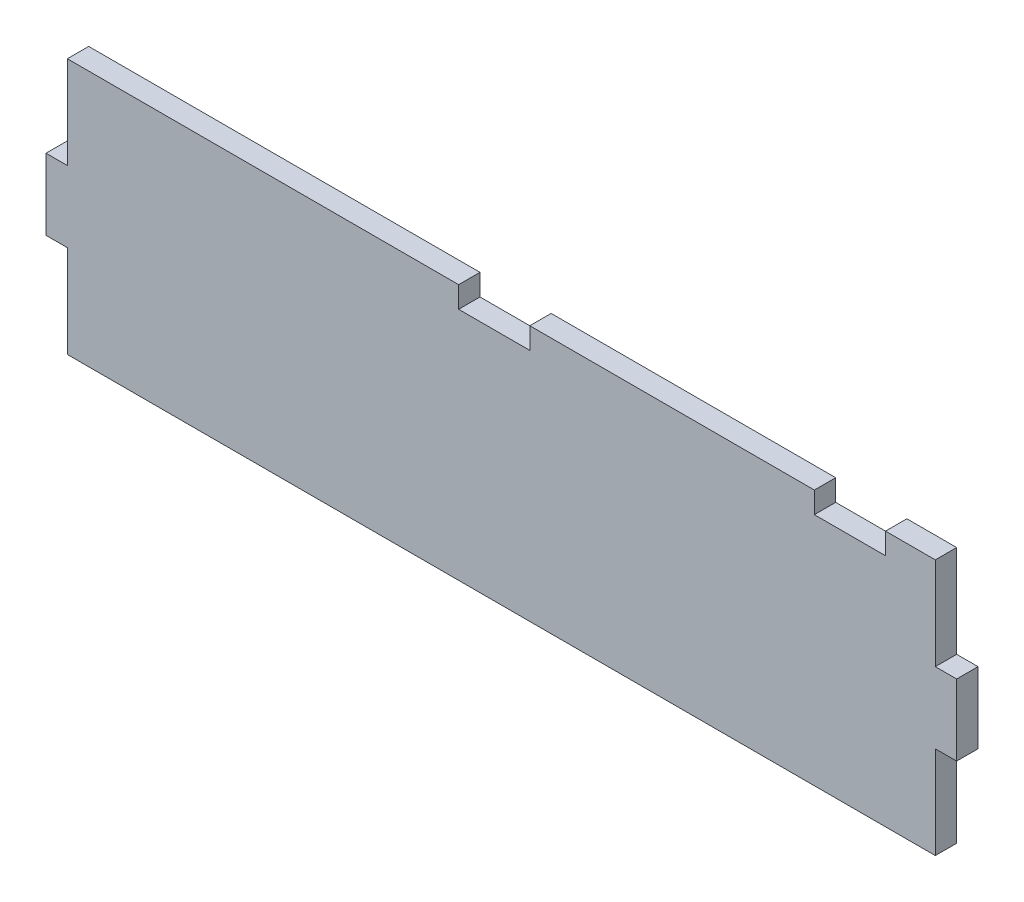
ISO-10303-21;
HEADER;
FILE_DESCRIPTION(('STEP AP214'),'2;1');
FILE_NAME('part.step','',(''),(''),'','','');
FILE_SCHEMA(('AUTOMOTIVE_DESIGN { 1 0 10303 214 1 1 1 1 }'));
ENDSEC;
DATA;
#1=APPLICATION_CONTEXT('core data for automotive mechanical design processes');
#2=APPLICATION_PROTOCOL_DEFINITION('international standard','automotive_design',2000,#1);
#3=PRODUCT_CONTEXT('',#1,'mechanical');
#4=PRODUCT('Part','Part','',(#3));
#5=PRODUCT_RELATED_PRODUCT_CATEGORY('part','',(#4));
#6=PRODUCT_DEFINITION_FORMATION('','',#4);
#7=PRODUCT_DEFINITION_CONTEXT('part definition',#1,'design');
#8=PRODUCT_DEFINITION('design','',#6,#7);
#9=PRODUCT_DEFINITION_SHAPE('','',#8);
#10=(LENGTH_UNIT() NAMED_UNIT(*) SI_UNIT(.MILLI.,.METRE.));
#11=(NAMED_UNIT(*) PLANE_ANGLE_UNIT() SI_UNIT($,.RADIAN.));
#12=(NAMED_UNIT(*) SI_UNIT($,.STERADIAN.) SOLID_ANGLE_UNIT());
#13=UNCERTAINTY_MEASURE_WITH_UNIT(LENGTH_MEASURE(1.E-05),#10,'distance_accuracy_value','');
#14=(GEOMETRIC_REPRESENTATION_CONTEXT(3) GLOBAL_UNCERTAINTY_ASSIGNED_CONTEXT((#13)) GLOBAL_UNIT_ASSIGNED_CONTEXT((#10,
#11,#12)) REPRESENTATION_CONTEXT('',''));
#15=CARTESIAN_POINT('',(0.,0.,0.));
#16=DIRECTION('',(0.,0.,1.));
#17=DIRECTION('',(1.,0.,0.));
#18=AXIS2_PLACEMENT_3D('',#15,#16,#17);
#19=CARTESIAN_POINT('',(0.,0.,6.));
#20=DIRECTION('',(0.,1.,0.));
#21=DIRECTION('',(0.,0.,1.));
#22=AXIS2_PLACEMENT_3D('',#19,#20,#21);
#23=PLANE('',#22);
#24=DIRECTION('',(1.,0.,0.));
#25=VECTOR('',#24,1.);
#26=CARTESIAN_POINT('',(0.,0.,0.));
#27=LINE('',#26,#25);
#28=CARTESIAN_POINT('',(0.,0.,0.));
#29=VERTEX_POINT('',#28);
#30=CARTESIAN_POINT('',(244.,0.,0.));
#31=VERTEX_POINT('',#30);
#32=EDGE_CURVE('E201',#29,#31,#27,.T.);
#33=ORIENTED_EDGE('',*,*,#32,.T.);
#34=DIRECTION('',(0.,0.,-1.));
#35=VECTOR('',#34,1.);
#36=CARTESIAN_POINT('',(244.,0.,6.));
#37=LINE('',#36,#35);
#38=CARTESIAN_POINT('',(244.,0.,6.));
#39=VERTEX_POINT('',#38);
#40=EDGE_CURVE('E11',#39,#31,#37,.T.);
#41=ORIENTED_EDGE('',*,*,#40,.F.);
#42=DIRECTION('',(1.,0.,0.));
#43=VECTOR('',#42,1.);
#44=CARTESIAN_POINT('',(0.,0.,6.));
#45=LINE('',#44,#43);
#46=CARTESIAN_POINT('',(0.,0.,6.));
#47=VERTEX_POINT('',#46);
#48=EDGE_CURVE('E240',#47,#39,#45,.T.);
#49=ORIENTED_EDGE('',*,*,#48,.F.);
#50=DIRECTION('',(0.,0.,-1.));
#51=VECTOR('',#50,1.);
#52=CARTESIAN_POINT('',(0.,0.,6.));
#53=LINE('',#52,#51);
#54=EDGE_CURVE('E197',#47,#29,#53,.T.);
#55=ORIENTED_EDGE('',*,*,#54,.T.);
#56=EDGE_LOOP('',(#33,#41,#49,#55));
#57=FACE_BOUND('',#56,.T.);
#58=ADVANCED_FACE('F33',(#57),#23,.F.);
#59=CARTESIAN_POINT('',(244.,0.,6.));
#60=DIRECTION('',(-1.,0.,0.));
#61=DIRECTION('',(0.,0.,1.));
#62=AXIS2_PLACEMENT_3D('',#59,#60,#61);
#63=PLANE('',#62);
#64=DIRECTION('',(0.,1.,0.));
#65=VECTOR('',#64,1.);
#66=CARTESIAN_POINT('',(244.,0.,0.));
#67=LINE('',#66,#65);
#68=CARTESIAN_POINT('',(244.,26.,0.));
#69=VERTEX_POINT('',#68);
#70=EDGE_CURVE('E204',#31,#69,#67,.T.);
#71=ORIENTED_EDGE('',*,*,#70,.T.);
#72=DIRECTION('',(0.,0.,-1.));
#73=VECTOR('',#72,1.);
#74=CARTESIAN_POINT('',(244.,26.,6.));
#75=LINE('',#74,#73);
#76=CARTESIAN_POINT('',(244.,26.,6.));
#77=VERTEX_POINT('',#76);
#78=EDGE_CURVE('E41',#77,#69,#75,.T.);
#79=ORIENTED_EDGE('',*,*,#78,.F.);
#80=DIRECTION('',(0.,1.,0.));
#81=VECTOR('',#80,1.);
#82=CARTESIAN_POINT('',(244.,0.,6.));
#83=LINE('',#82,#81);
#84=EDGE_CURVE('E128',#39,#77,#83,.T.);
#85=ORIENTED_EDGE('',*,*,#84,.F.);
#86=ORIENTED_EDGE('',*,*,#40,.T.);
#87=EDGE_LOOP('',(#71,#79,#85,#86));
#88=FACE_BOUND('',#87,.T.);
#89=ADVANCED_FACE('F357',(#88),#63,.F.);
#90=CARTESIAN_POINT('',(244.,26.,6.));
#91=DIRECTION('',(0.,1.,0.));
#92=DIRECTION('',(0.,0.,1.));
#93=AXIS2_PLACEMENT_3D('',#90,#91,#92);
#94=PLANE('',#93);
#95=DIRECTION('',(1.,0.,0.));
#96=VECTOR('',#95,1.);
#97=CARTESIAN_POINT('',(244.,26.,0.));
#98=LINE('',#97,#96);
#99=CARTESIAN_POINT('',(250.,26.,0.));
#100=VERTEX_POINT('',#99);
#101=EDGE_CURVE('E206',#69,#100,#98,.T.);
#102=ORIENTED_EDGE('',*,*,#101,.T.);
#103=DIRECTION('',(0.,0.,-1.));
#104=VECTOR('',#103,1.);
#105=CARTESIAN_POINT('',(250.,26.,6.));
#106=LINE('',#105,#104);
#107=CARTESIAN_POINT('',(250.,26.,6.));
#108=VERTEX_POINT('',#107);
#109=EDGE_CURVE('E283',#108,#100,#106,.T.);
#110=ORIENTED_EDGE('',*,*,#109,.F.);
#111=DIRECTION('',(1.,0.,0.));
#112=VECTOR('',#111,1.);
#113=CARTESIAN_POINT('',(244.,26.,6.));
#114=LINE('',#113,#112);
#115=EDGE_CURVE('E291',#77,#108,#114,.T.);
#116=ORIENTED_EDGE('',*,*,#115,.F.);
#117=ORIENTED_EDGE('',*,*,#78,.T.);
#118=EDGE_LOOP('',(#102,#110,#116,#117));
#119=FACE_BOUND('',#118,.T.);
#120=ADVANCED_FACE('F289',(#119),#94,.F.);
#121=CARTESIAN_POINT('',(250.,26.,6.));
#122=DIRECTION('',(-1.,0.,0.));
#123=DIRECTION('',(0.,0.,1.));
#124=AXIS2_PLACEMENT_3D('',#121,#122,#123);
#125=PLANE('',#124);
#126=DIRECTION('',(0.,1.,0.));
#127=VECTOR('',#126,1.);
#128=CARTESIAN_POINT('',(250.,26.,0.));
#129=LINE('',#128,#127);
#130=CARTESIAN_POINT('',(250.,46.,0.));
#131=VERTEX_POINT('',#130);
#132=EDGE_CURVE('E208',#100,#131,#129,.T.);
#133=ORIENTED_EDGE('',*,*,#132,.T.);
#134=DIRECTION('',(0.,0.,-1.));
#135=VECTOR('',#134,1.);
#136=CARTESIAN_POINT('',(250.,46.,6.));
#137=LINE('',#136,#135);
#138=CARTESIAN_POINT('',(250.,46.,6.));
#139=VERTEX_POINT('',#138);
#140=EDGE_CURVE('E280',#139,#131,#137,.T.);
#141=ORIENTED_EDGE('',*,*,#140,.F.);
#142=DIRECTION('',(0.,1.,0.));
#143=VECTOR('',#142,1.);
#144=CARTESIAN_POINT('',(250.,26.,6.));
#145=LINE('',#144,#143);
#146=EDGE_CURVE('E308',#108,#139,#145,.T.);
#147=ORIENTED_EDGE('',*,*,#146,.F.);
#148=ORIENTED_EDGE('',*,*,#109,.T.);
#149=EDGE_LOOP('',(#133,#141,#147,#148));
#150=FACE_BOUND('',#149,.T.);
#151=ADVANCED_FACE('F299',(#150),#125,.F.);
#152=CARTESIAN_POINT('',(250.,46.,6.));
#153=DIRECTION('',(0.,-1.,0.));
#154=DIRECTION('',(0.,0.,-1.));
#155=AXIS2_PLACEMENT_3D('',#152,#153,#154);
#156=PLANE('',#155);
#157=DIRECTION('',(-1.,0.,0.));
#158=VECTOR('',#157,1.);
#159=CARTESIAN_POINT('',(250.,46.,0.));
#160=LINE('',#159,#158);
#161=CARTESIAN_POINT('',(244.,46.,0.));
#162=VERTEX_POINT('',#161);
#163=EDGE_CURVE('E210',#131,#162,#160,.T.);
#164=ORIENTED_EDGE('',*,*,#163,.T.);
#165=DIRECTION('',(0.,0.,-1.));
#166=VECTOR('',#165,1.);
#167=CARTESIAN_POINT('',(244.,46.,6.));
#168=LINE('',#167,#166);
#169=CARTESIAN_POINT('',(244.,46.,6.));
#170=VERTEX_POINT('',#169);
#171=EDGE_CURVE('E277',#170,#162,#168,.T.);
#172=ORIENTED_EDGE('',*,*,#171,.F.);
#173=DIRECTION('',(-1.,0.,0.));
#174=VECTOR('',#173,1.);
#175=CARTESIAN_POINT('',(250.,46.,6.));
#176=LINE('',#175,#174);
#177=EDGE_CURVE('E305',#139,#170,#176,.T.);
#178=ORIENTED_EDGE('',*,*,#177,.F.);
#179=ORIENTED_EDGE('',*,*,#140,.T.);
#180=EDGE_LOOP('',(#164,#172,#178,#179));
#181=FACE_BOUND('',#180,.T.);
#182=ADVANCED_FACE('F303',(#181),#156,.F.);
#183=CARTESIAN_POINT('',(244.,72.,6.));
#184=DIRECTION('',(-1.,0.,0.));
#185=DIRECTION('',(0.,0.,1.));
#186=AXIS2_PLACEMENT_3D('',#183,#184,#185);
#187=PLANE('',#186);
#188=DIRECTION('',(0.,1.,0.));
#189=VECTOR('',#188,1.);
#190=CARTESIAN_POINT('',(244.,72.,0.));
#191=LINE('',#190,#189);
#192=CARTESIAN_POINT('',(244.,72.,0.));
#193=VERTEX_POINT('',#192);
#194=EDGE_CURVE('E213',#162,#193,#191,.T.);
#195=ORIENTED_EDGE('',*,*,#194,.T.);
#196=DIRECTION('',(0.,0.,-1.));
#197=VECTOR('',#196,1.);
#198=CARTESIAN_POINT('',(244.,72.,6.));
#199=LINE('',#198,#197);
#200=CARTESIAN_POINT('',(244.,72.,6.));
#201=VERTEX_POINT('',#200);
#202=EDGE_CURVE('E274',#201,#193,#199,.T.);
#203=ORIENTED_EDGE('',*,*,#202,.F.);
#204=DIRECTION('',(0.,1.,0.));
#205=VECTOR('',#204,1.);
#206=CARTESIAN_POINT('',(244.,46.,6.));
#207=LINE('',#206,#205);
#208=EDGE_CURVE('E307',#170,#201,#207,.T.);
#209=ORIENTED_EDGE('',*,*,#208,.F.);
#210=ORIENTED_EDGE('',*,*,#171,.T.);
#211=EDGE_LOOP('',(#195,#203,#209,#210));
#212=FACE_BOUND('',#211,.T.);
#213=ADVANCED_FACE('F370',(#212),#187,.F.);
#214=CARTESIAN_POINT('',(230.,72.,6.));
#215=DIRECTION('',(0.,-1.,0.));
#216=DIRECTION('',(1.,0.,0.));
#217=AXIS2_PLACEMENT_3D('',#214,#215,#216);
#218=PLANE('',#217);
#219=DIRECTION('',(-1.,0.,0.));
#220=VECTOR('',#219,1.);
#221=CARTESIAN_POINT('',(230.,72.,0.));
#222=LINE('',#221,#220);
#223=CARTESIAN_POINT('',(230.,72.,0.));
#224=VERTEX_POINT('',#223);
#225=EDGE_CURVE('E215',#193,#224,#222,.T.);
#226=ORIENTED_EDGE('',*,*,#225,.T.);
#227=DIRECTION('',(0.,0.,-1.));
#228=VECTOR('',#227,1.);
#229=CARTESIAN_POINT('',(230.,72.,6.));
#230=LINE('',#229,#228);
#231=CARTESIAN_POINT('',(230.,72.,6.));
#232=VERTEX_POINT('',#231);
#233=EDGE_CURVE('E271',#232,#224,#230,.T.);
#234=ORIENTED_EDGE('',*,*,#233,.F.);
#235=DIRECTION('',(-1.,0.,0.));
#236=VECTOR('',#235,1.);
#237=CARTESIAN_POINT('',(230.,72.,6.));
#238=LINE('',#237,#236);
#239=EDGE_CURVE('E310',#201,#232,#238,.T.);
#240=ORIENTED_EDGE('',*,*,#239,.F.);
#241=ORIENTED_EDGE('',*,*,#202,.T.);
#242=EDGE_LOOP('',(#226,#234,#240,#241));
#243=FACE_BOUND('',#242,.T.);
#244=ADVANCED_FACE('F373',(#243),#218,.F.);
#245=CARTESIAN_POINT('',(230.,66.,6.));
#246=DIRECTION('',(1.,0.,0.));
#247=DIRECTION('',(0.,0.,-1.));
#248=AXIS2_PLACEMENT_3D('',#245,#246,#247);
#249=PLANE('',#248);
#250=DIRECTION('',(0.,-1.,0.));
#251=VECTOR('',#250,1.);
#252=CARTESIAN_POINT('',(230.,66.,0.));
#253=LINE('',#252,#251);
#254=CARTESIAN_POINT('',(230.,66.,0.));
#255=VERTEX_POINT('',#254);
#256=EDGE_CURVE('E217',#224,#255,#253,.T.);
#257=ORIENTED_EDGE('',*,*,#256,.T.);
#258=DIRECTION('',(0.,0.,-1.));
#259=VECTOR('',#258,1.);
#260=CARTESIAN_POINT('',(230.,66.,6.));
#261=LINE('',#260,#259);
#262=CARTESIAN_POINT('',(230.,66.,6.));
#263=VERTEX_POINT('',#262);
#264=EDGE_CURVE('E268',#263,#255,#261,.T.);
#265=ORIENTED_EDGE('',*,*,#264,.F.);
#266=DIRECTION('',(0.,-1.,0.));
#267=VECTOR('',#266,1.);
#268=CARTESIAN_POINT('',(230.,66.,6.));
#269=LINE('',#268,#267);
#270=EDGE_CURVE('E316',#232,#263,#269,.T.);
#271=ORIENTED_EDGE('',*,*,#270,.F.);
#272=ORIENTED_EDGE('',*,*,#233,.T.);
#273=EDGE_LOOP('',(#257,#265,#271,#272));
#274=FACE_BOUND('',#273,.T.);
#275=ADVANCED_FACE('F377',(#274),#249,.F.);
#276=CARTESIAN_POINT('',(210.,66.,6.));
#277=DIRECTION('',(0.,-1.,0.));
#278=DIRECTION('',(0.,0.,-1.));
#279=AXIS2_PLACEMENT_3D('',#276,#277,#278);
#280=PLANE('',#279);
#281=DIRECTION('',(-1.,0.,0.));
#282=VECTOR('',#281,1.);
#283=CARTESIAN_POINT('',(210.,66.,0.));
#284=LINE('',#283,#282);
#285=CARTESIAN_POINT('',(210.,66.,0.));
#286=VERTEX_POINT('',#285);
#287=EDGE_CURVE('E219',#255,#286,#284,.T.);
#288=ORIENTED_EDGE('',*,*,#287,.T.);
#289=DIRECTION('',(0.,0.,-1.));
#290=VECTOR('',#289,1.);
#291=CARTESIAN_POINT('',(210.,66.,6.));
#292=LINE('',#291,#290);
#293=CARTESIAN_POINT('',(210.,66.,6.));
#294=VERTEX_POINT('',#293);
#295=EDGE_CURVE('E265',#294,#286,#292,.T.);
#296=ORIENTED_EDGE('',*,*,#295,.F.);
#297=DIRECTION('',(-1.,0.,0.));
#298=VECTOR('',#297,1.);
#299=CARTESIAN_POINT('',(210.,66.,6.));
#300=LINE('',#299,#298);
#301=EDGE_CURVE('E318',#263,#294,#300,.T.);
#302=ORIENTED_EDGE('',*,*,#301,.F.);
#303=ORIENTED_EDGE('',*,*,#264,.T.);
#304=EDGE_LOOP('',(#288,#296,#302,#303));
#305=FACE_BOUND('',#304,.T.);
#306=ADVANCED_FACE('F381',(#305),#280,.F.);
#307=CARTESIAN_POINT('',(210.,72.,6.));
#308=DIRECTION('',(-1.,0.,0.));
#309=DIRECTION('',(0.,0.,1.));
#310=AXIS2_PLACEMENT_3D('',#307,#308,#309);
#311=PLANE('',#310);
#312=DIRECTION('',(0.,1.,0.));
#313=VECTOR('',#312,1.);
#314=CARTESIAN_POINT('',(210.,72.,0.));
#315=LINE('',#314,#313);
#316=CARTESIAN_POINT('',(210.,72.,0.));
#317=VERTEX_POINT('',#316);
#318=EDGE_CURVE('E221',#286,#317,#315,.T.);
#319=ORIENTED_EDGE('',*,*,#318,.T.);
#320=DIRECTION('',(0.,0.,-1.));
#321=VECTOR('',#320,1.);
#322=CARTESIAN_POINT('',(210.,72.,6.));
#323=LINE('',#322,#321);
#324=CARTESIAN_POINT('',(210.,72.,6.));
#325=VERTEX_POINT('',#324);
#326=EDGE_CURVE('E262',#325,#317,#323,.T.);
#327=ORIENTED_EDGE('',*,*,#326,.F.);
#328=DIRECTION('',(0.,1.,0.));
#329=VECTOR('',#328,1.);
#330=CARTESIAN_POINT('',(210.,72.,6.));
#331=LINE('',#330,#329);
#332=EDGE_CURVE('E320',#294,#325,#331,.T.);
#333=ORIENTED_EDGE('',*,*,#332,.F.);
#334=ORIENTED_EDGE('',*,*,#295,.T.);
#335=EDGE_LOOP('',(#319,#327,#333,#334));
#336=FACE_BOUND('',#335,.T.);
#337=ADVANCED_FACE('F385',(#336),#311,.F.);
#338=CARTESIAN_POINT('',(130.,72.,6.));
#339=DIRECTION('',(0.,-1.,0.));
#340=DIRECTION('',(0.,0.,-1.));
#341=AXIS2_PLACEMENT_3D('',#338,#339,#340);
#342=PLANE('',#341);
#343=DIRECTION('',(-1.,0.,0.));
#344=VECTOR('',#343,1.);
#345=CARTESIAN_POINT('',(130.,72.,0.));
#346=LINE('',#345,#344);
#347=CARTESIAN_POINT('',(130.,72.,0.));
#348=VERTEX_POINT('',#347);
#349=EDGE_CURVE('E223',#317,#348,#346,.T.);
#350=ORIENTED_EDGE('',*,*,#349,.T.);
#351=DIRECTION('',(0.,0.,-1.));
#352=VECTOR('',#351,1.);
#353=CARTESIAN_POINT('',(130.,72.,6.));
#354=LINE('',#353,#352);
#355=CARTESIAN_POINT('',(130.,72.,6.));
#356=VERTEX_POINT('',#355);
#357=EDGE_CURVE('E259',#356,#348,#354,.T.);
#358=ORIENTED_EDGE('',*,*,#357,.F.);
#359=DIRECTION('',(-1.,0.,0.));
#360=VECTOR('',#359,1.);
#361=CARTESIAN_POINT('',(130.,72.,6.));
#362=LINE('',#361,#360);
#363=EDGE_CURVE('E322',#325,#356,#362,.T.);
#364=ORIENTED_EDGE('',*,*,#363,.F.);
#365=ORIENTED_EDGE('',*,*,#326,.T.);
#366=EDGE_LOOP('',(#350,#358,#364,#365));
#367=FACE_BOUND('',#366,.T.);
#368=ADVANCED_FACE('F389',(#367),#342,.F.);
#369=CARTESIAN_POINT('',(130.,66.,6.));
#370=DIRECTION('',(1.,0.,0.));
#371=DIRECTION('',(0.,0.,-1.));
#372=AXIS2_PLACEMENT_3D('',#369,#370,#371);
#373=PLANE('',#372);
#374=DIRECTION('',(0.,-1.,0.));
#375=VECTOR('',#374,1.);
#376=CARTESIAN_POINT('',(130.,66.,0.));
#377=LINE('',#376,#375);
#378=CARTESIAN_POINT('',(130.,66.,0.));
#379=VERTEX_POINT('',#378);
#380=EDGE_CURVE('E225',#348,#379,#377,.T.);
#381=ORIENTED_EDGE('',*,*,#380,.T.);
#382=DIRECTION('',(0.,0.,-1.));
#383=VECTOR('',#382,1.);
#384=CARTESIAN_POINT('',(130.,66.,6.));
#385=LINE('',#384,#383);
#386=CARTESIAN_POINT('',(130.,66.,6.));
#387=VERTEX_POINT('',#386);
#388=EDGE_CURVE('E256',#387,#379,#385,.T.);
#389=ORIENTED_EDGE('',*,*,#388,.F.);
#390=DIRECTION('',(0.,-1.,0.));
#391=VECTOR('',#390,1.);
#392=CARTESIAN_POINT('',(130.,66.,6.));
#393=LINE('',#392,#391);
#394=EDGE_CURVE('E324',#356,#387,#393,.T.);
#395=ORIENTED_EDGE('',*,*,#394,.F.);
#396=ORIENTED_EDGE('',*,*,#357,.T.);
#397=EDGE_LOOP('',(#381,#389,#395,#396));
#398=FACE_BOUND('',#397,.T.);
#399=ADVANCED_FACE('F393',(#398),#373,.F.);
#400=CARTESIAN_POINT('',(110.,66.,6.));
#401=DIRECTION('',(0.,-1.,0.));
#402=DIRECTION('',(0.,0.,-1.));
#403=AXIS2_PLACEMENT_3D('',#400,#401,#402);
#404=PLANE('',#403);
#405=DIRECTION('',(-1.,0.,0.));
#406=VECTOR('',#405,1.);
#407=CARTESIAN_POINT('',(110.,66.,0.));
#408=LINE('',#407,#406);
#409=CARTESIAN_POINT('',(110.,66.,0.));
#410=VERTEX_POINT('',#409);
#411=EDGE_CURVE('E227',#379,#410,#408,.T.);
#412=ORIENTED_EDGE('',*,*,#411,.T.);
#413=DIRECTION('',(0.,0.,-1.));
#414=VECTOR('',#413,1.);
#415=CARTESIAN_POINT('',(110.,66.,6.));
#416=LINE('',#415,#414);
#417=CARTESIAN_POINT('',(110.,66.,6.));
#418=VERTEX_POINT('',#417);
#419=EDGE_CURVE('E253',#418,#410,#416,.T.);
#420=ORIENTED_EDGE('',*,*,#419,.F.);
#421=DIRECTION('',(-1.,0.,0.));
#422=VECTOR('',#421,1.);
#423=CARTESIAN_POINT('',(110.,66.,6.));
#424=LINE('',#423,#422);
#425=EDGE_CURVE('E326',#387,#418,#424,.T.);
#426=ORIENTED_EDGE('',*,*,#425,.F.);
#427=ORIENTED_EDGE('',*,*,#388,.T.);
#428=EDGE_LOOP('',(#412,#420,#426,#427));
#429=FACE_BOUND('',#428,.T.);
#430=ADVANCED_FACE('F397',(#429),#404,.F.);
#431=CARTESIAN_POINT('',(110.,72.,6.));
#432=DIRECTION('',(-1.,0.,0.));
#433=DIRECTION('',(0.,0.,1.));
#434=AXIS2_PLACEMENT_3D('',#431,#432,#433);
#435=PLANE('',#434);
#436=DIRECTION('',(0.,1.,0.));
#437=VECTOR('',#436,1.);
#438=CARTESIAN_POINT('',(110.,72.,0.));
#439=LINE('',#438,#437);
#440=CARTESIAN_POINT('',(110.,72.,0.));
#441=VERTEX_POINT('',#440);
#442=EDGE_CURVE('E229',#410,#441,#439,.T.);
#443=ORIENTED_EDGE('',*,*,#442,.T.);
#444=DIRECTION('',(0.,0.,-1.));
#445=VECTOR('',#444,1.);
#446=CARTESIAN_POINT('',(110.,72.,6.));
#447=LINE('',#446,#445);
#448=CARTESIAN_POINT('',(110.,72.,6.));
#449=VERTEX_POINT('',#448);
#450=EDGE_CURVE('E250',#449,#441,#447,.T.);
#451=ORIENTED_EDGE('',*,*,#450,.F.);
#452=DIRECTION('',(0.,1.,0.));
#453=VECTOR('',#452,1.);
#454=CARTESIAN_POINT('',(110.,72.,6.));
#455=LINE('',#454,#453);
#456=EDGE_CURVE('E328',#418,#449,#455,.T.);
#457=ORIENTED_EDGE('',*,*,#456,.F.);
#458=ORIENTED_EDGE('',*,*,#419,.T.);
#459=EDGE_LOOP('',(#443,#451,#457,#458));
#460=FACE_BOUND('',#459,.T.);
#461=ADVANCED_FACE('F401',(#460),#435,.F.);
#462=CARTESIAN_POINT('',(110.,72.,6.));
#463=DIRECTION('',(0.,-1.,0.));
#464=DIRECTION('',(0.,0.,-1.));
#465=AXIS2_PLACEMENT_3D('',#462,#463,#464);
#466=PLANE('',#465);
#467=DIRECTION('',(-1.,0.,0.));
#468=VECTOR('',#467,1.);
#469=CARTESIAN_POINT('',(110.,72.,0.));
#470=LINE('',#469,#468);
#471=CARTESIAN_POINT('',(0.,72.,0.));
#472=VERTEX_POINT('',#471);
#473=EDGE_CURVE('E231',#441,#472,#470,.T.);
#474=ORIENTED_EDGE('',*,*,#473,.T.);
#475=DIRECTION('',(0.,0.,-1.));
#476=VECTOR('',#475,1.);
#477=CARTESIAN_POINT('',(0.,72.,6.));
#478=LINE('',#477,#476);
#479=CARTESIAN_POINT('',(0.,72.,6.));
#480=VERTEX_POINT('',#479);
#481=EDGE_CURVE('E247',#480,#472,#478,.T.);
#482=ORIENTED_EDGE('',*,*,#481,.F.);
#483=DIRECTION('',(-1.,0.,0.));
#484=VECTOR('',#483,1.);
#485=CARTESIAN_POINT('',(110.,72.,6.));
#486=LINE('',#485,#484);
#487=EDGE_CURVE('E330',#449,#480,#486,.T.);
#488=ORIENTED_EDGE('',*,*,#487,.F.);
#489=ORIENTED_EDGE('',*,*,#450,.T.);
#490=EDGE_LOOP('',(#474,#482,#488,#489));
#491=FACE_BOUND('',#490,.T.);
#492=ADVANCED_FACE('F405',(#491),#466,.F.);
#493=CARTESIAN_POINT('',(0.,72.,6.));
#494=DIRECTION('',(1.,0.,0.));
#495=DIRECTION('',(0.,1.,0.));
#496=AXIS2_PLACEMENT_3D('',#493,#494,#495);
#497=PLANE('',#496);
#498=DIRECTION('',(0.,-1.,0.));
#499=VECTOR('',#498,1.);
#500=CARTESIAN_POINT('',(0.,72.,0.));
#501=LINE('',#500,#499);
#502=CARTESIAN_POINT('',(0.,46.,0.));
#503=VERTEX_POINT('',#502);
#504=EDGE_CURVE('E233',#472,#503,#501,.T.);
#505=ORIENTED_EDGE('',*,*,#504,.T.);
#506=DIRECTION('',(0.,0.,-1.));
#507=VECTOR('',#506,1.);
#508=CARTESIAN_POINT('',(0.,46.,6.));
#509=LINE('',#508,#507);
#510=CARTESIAN_POINT('',(0.,46.,6.));
#511=VERTEX_POINT('',#510);
#512=EDGE_CURVE('E244',#511,#503,#509,.T.);
#513=ORIENTED_EDGE('',*,*,#512,.F.);
#514=DIRECTION('',(0.,-1.,0.));
#515=VECTOR('',#514,1.);
#516=CARTESIAN_POINT('',(0.,72.,6.));
#517=LINE('',#516,#515);
#518=EDGE_CURVE('E332',#480,#511,#517,.T.);
#519=ORIENTED_EDGE('',*,*,#518,.F.);
#520=ORIENTED_EDGE('',*,*,#481,.T.);
#521=EDGE_LOOP('',(#505,#513,#519,#520));
#522=FACE_BOUND('',#521,.T.);
#523=ADVANCED_FACE('F338',(#522),#497,.F.);
#524=CARTESIAN_POINT('',(-6.,46.,6.));
#525=DIRECTION('',(0.,-1.,0.));
#526=DIRECTION('',(0.,0.,-1.));
#527=AXIS2_PLACEMENT_3D('',#524,#525,#526);
#528=PLANE('',#527);
#529=DIRECTION('',(-1.,0.,0.));
#530=VECTOR('',#529,1.);
#531=CARTESIAN_POINT('',(-6.,46.,0.));
#532=LINE('',#531,#530);
#533=CARTESIAN_POINT('',(-6.,46.,0.));
#534=VERTEX_POINT('',#533);
#535=EDGE_CURVE('E235',#503,#534,#532,.T.);
#536=ORIENTED_EDGE('',*,*,#535,.T.);
#537=DIRECTION('',(0.,0.,-1.));
#538=VECTOR('',#537,1.);
#539=CARTESIAN_POINT('',(-6.,46.,6.));
#540=LINE('',#539,#538);
#541=CARTESIAN_POINT('',(-6.,46.,6.));
#542=VERTEX_POINT('',#541);
#543=EDGE_CURVE('E192',#542,#534,#540,.T.);
#544=ORIENTED_EDGE('',*,*,#543,.F.);
#545=DIRECTION('',(-1.,0.,0.));
#546=VECTOR('',#545,1.);
#547=CARTESIAN_POINT('',(-6.,46.,6.));
#548=LINE('',#547,#546);
#549=EDGE_CURVE('E183',#511,#542,#548,.T.);
#550=ORIENTED_EDGE('',*,*,#549,.F.);
#551=ORIENTED_EDGE('',*,*,#512,.T.);
#552=EDGE_LOOP('',(#536,#544,#550,#551));
#553=FACE_BOUND('',#552,.T.);
#554=ADVANCED_FACE('F342',(#553),#528,.F.);
#555=CARTESIAN_POINT('',(-6.,26.,6.));
#556=DIRECTION('',(1.,0.,0.));
#557=DIRECTION('',(0.,0.,-1.));
#558=AXIS2_PLACEMENT_3D('',#555,#556,#557);
#559=PLANE('',#558);
#560=DIRECTION('',(0.,-1.,0.));
#561=VECTOR('',#560,1.);
#562=CARTESIAN_POINT('',(-6.,26.,0.));
#563=LINE('',#562,#561);
#564=CARTESIAN_POINT('',(-6.,26.,0.));
#565=VERTEX_POINT('',#564);
#566=EDGE_CURVE('E191',#534,#565,#563,.T.);
#567=ORIENTED_EDGE('',*,*,#566,.T.);
#568=DIRECTION('',(0.,0.,-1.));
#569=VECTOR('',#568,1.);
#570=CARTESIAN_POINT('',(-6.,26.,6.));
#571=LINE('',#570,#569);
#572=CARTESIAN_POINT('',(-6.,26.,6.));
#573=VERTEX_POINT('',#572);
#574=EDGE_CURVE('E188',#573,#565,#571,.T.);
#575=ORIENTED_EDGE('',*,*,#574,.F.);
#576=DIRECTION('',(0.,-1.,0.));
#577=VECTOR('',#576,1.);
#578=CARTESIAN_POINT('',(-6.,26.,6.));
#579=LINE('',#578,#577);
#580=EDGE_CURVE('E177',#542,#573,#579,.T.);
#581=ORIENTED_EDGE('',*,*,#580,.F.);
#582=ORIENTED_EDGE('',*,*,#543,.T.);
#583=EDGE_LOOP('',(#567,#575,#581,#582));
#584=FACE_BOUND('',#583,.T.);
#585=ADVANCED_FACE('F189',(#584),#559,.F.);
#586=CARTESIAN_POINT('',(0.,26.,6.));
#587=DIRECTION('',(0.,1.,0.));
#588=DIRECTION('',(0.,0.,1.));
#589=AXIS2_PLACEMENT_3D('',#586,#587,#588);
#590=PLANE('',#589);
#591=DIRECTION('',(1.,0.,0.));
#592=VECTOR('',#591,1.);
#593=CARTESIAN_POINT('',(0.,26.,0.));
#594=LINE('',#593,#592);
#595=CARTESIAN_POINT('',(0.,26.,0.));
#596=VERTEX_POINT('',#595);
#597=EDGE_CURVE('E114',#565,#596,#594,.T.);
#598=ORIENTED_EDGE('',*,*,#597,.T.);
#599=DIRECTION('',(0.,0.,-1.));
#600=VECTOR('',#599,1.);
#601=CARTESIAN_POINT('',(0.,26.,6.));
#602=LINE('',#601,#600);
#603=CARTESIAN_POINT('',(0.,26.,6.));
#604=VERTEX_POINT('',#603);
#605=EDGE_CURVE('E193',#604,#596,#602,.T.);
#606=ORIENTED_EDGE('',*,*,#605,.F.);
#607=DIRECTION('',(1.,0.,0.));
#608=VECTOR('',#607,1.);
#609=CARTESIAN_POINT('',(0.,26.,6.));
#610=LINE('',#609,#608);
#611=EDGE_CURVE('E181',#573,#604,#610,.T.);
#612=ORIENTED_EDGE('',*,*,#611,.F.);
#613=ORIENTED_EDGE('',*,*,#574,.T.);
#614=EDGE_LOOP('',(#598,#606,#612,#613));
#615=FACE_BOUND('',#614,.T.);
#616=ADVANCED_FACE('F195',(#615),#590,.F.);
#617=CARTESIAN_POINT('',(0.,0.,6.));
#618=DIRECTION('',(1.,0.,0.));
#619=DIRECTION('',(0.,0.,-1.));
#620=AXIS2_PLACEMENT_3D('',#617,#618,#619);
#621=PLANE('',#620);
#622=DIRECTION('',(0.,-1.,0.));
#623=VECTOR('',#622,1.);
#624=CARTESIAN_POINT('',(0.,0.,0.));
#625=LINE('',#624,#623);
#626=EDGE_CURVE('E120',#596,#29,#625,.T.);
#627=ORIENTED_EDGE('',*,*,#626,.T.);
#628=ORIENTED_EDGE('',*,*,#54,.F.);
#629=DIRECTION('',(0.,-1.,0.));
#630=VECTOR('',#629,1.);
#631=CARTESIAN_POINT('',(0.,0.,6.));
#632=LINE('',#631,#630);
#633=EDGE_CURVE('E49',#604,#47,#632,.T.);
#634=ORIENTED_EDGE('',*,*,#633,.F.);
#635=ORIENTED_EDGE('',*,*,#605,.T.);
#636=EDGE_LOOP('',(#627,#628,#634,#635));
#637=FACE_BOUND('',#636,.T.);
#638=ADVANCED_FACE('F346',(#637),#621,.F.);
#639=CARTESIAN_POINT('',(0.,0.,6.));
#640=DIRECTION('',(0.,0.,1.));
#641=DIRECTION('',(1.,0.,0.));
#642=AXIS2_PLACEMENT_3D('',#639,#640,#641);
#643=PLANE('',#642);
#644=ORIENTED_EDGE('',*,*,#48,.T.);
#645=ORIENTED_EDGE('',*,*,#84,.T.);
#646=ORIENTED_EDGE('',*,*,#115,.T.);
#647=ORIENTED_EDGE('',*,*,#146,.T.);
#648=ORIENTED_EDGE('',*,*,#177,.T.);
#649=ORIENTED_EDGE('',*,*,#208,.T.);
#650=ORIENTED_EDGE('',*,*,#239,.T.);
#651=ORIENTED_EDGE('',*,*,#270,.T.);
#652=ORIENTED_EDGE('',*,*,#301,.T.);
#653=ORIENTED_EDGE('',*,*,#332,.T.);
#654=ORIENTED_EDGE('',*,*,#363,.T.);
#655=ORIENTED_EDGE('',*,*,#394,.T.);
#656=ORIENTED_EDGE('',*,*,#425,.T.);
#657=ORIENTED_EDGE('',*,*,#456,.T.);
#658=ORIENTED_EDGE('',*,*,#487,.T.);
#659=ORIENTED_EDGE('',*,*,#518,.T.);
#660=ORIENTED_EDGE('',*,*,#549,.T.);
#661=ORIENTED_EDGE('',*,*,#580,.T.);
#662=ORIENTED_EDGE('',*,*,#611,.T.);
#663=ORIENTED_EDGE('',*,*,#633,.T.);
#664=EDGE_LOOP('',(#644,#645,#646,#647,#648,#649,#650,#651,#652,#653,#654,#655,#656,#657,#658,
#659,#660,#661,#662,#663));
#665=FACE_BOUND('',#664,.T.);
#666=ADVANCED_FACE('F179',(#665),#643,.T.);
#667=CARTESIAN_POINT('',(0.,0.,0.));
#668=DIRECTION('',(0.,0.,1.));
#669=DIRECTION('',(1.,0.,0.));
#670=AXIS2_PLACEMENT_3D('',#667,#668,#669);
#671=PLANE('',#670);
#672=ORIENTED_EDGE('',*,*,#32,.F.);
#673=ORIENTED_EDGE('',*,*,#626,.F.);
#674=ORIENTED_EDGE('',*,*,#597,.F.);
#675=ORIENTED_EDGE('',*,*,#566,.F.);
#676=ORIENTED_EDGE('',*,*,#535,.F.);
#677=ORIENTED_EDGE('',*,*,#504,.F.);
#678=ORIENTED_EDGE('',*,*,#473,.F.);
#679=ORIENTED_EDGE('',*,*,#442,.F.);
#680=ORIENTED_EDGE('',*,*,#411,.F.);
#681=ORIENTED_EDGE('',*,*,#380,.F.);
#682=ORIENTED_EDGE('',*,*,#349,.F.);
#683=ORIENTED_EDGE('',*,*,#318,.F.);
#684=ORIENTED_EDGE('',*,*,#287,.F.);
#685=ORIENTED_EDGE('',*,*,#256,.F.);
#686=ORIENTED_EDGE('',*,*,#225,.F.);
#687=ORIENTED_EDGE('',*,*,#194,.F.);
#688=ORIENTED_EDGE('',*,*,#163,.F.);
#689=ORIENTED_EDGE('',*,*,#132,.F.);
#690=ORIENTED_EDGE('',*,*,#101,.F.);
#691=ORIENTED_EDGE('',*,*,#70,.F.);
#692=EDGE_LOOP('',(#672,#673,#674,#675,#676,#677,#678,#679,#680,#681,#682,#683,#684,#685,#686,
#687,#688,#689,#690,#691));
#693=FACE_BOUND('',#692,.T.);
#694=ADVANCED_FACE('F295',(#693),#671,.F.);
#695=CLOSED_SHELL('',(#58,#89,#120,#151,#182,#213,#244,#275,#306,#337,#368,#399,#430,#461,#492,
#523,#554,#585,#616,#638,#666,#694));
#696=MANIFOLD_SOLID_BREP('B2',#695);
#697=ADVANCED_BREP_SHAPE_REPRESENTATION('',(#18,#696),#14);
#698=SHAPE_DEFINITION_REPRESENTATION(#9,#697);
ENDSEC;
END-ISO-10303-21;
